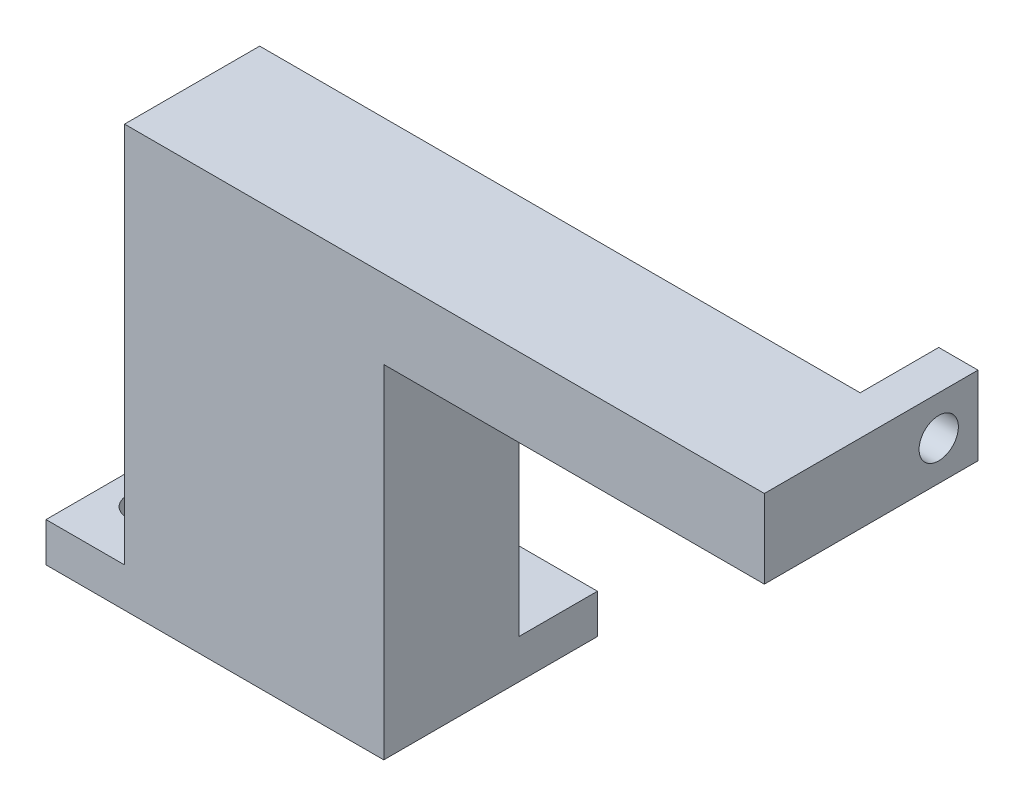
ISO-10303-21;
HEADER;
FILE_DESCRIPTION(('STEP AP214'),'2;1');
FILE_NAME('part.step','',(''),(''),'','','');
FILE_SCHEMA(('AUTOMOTIVE_DESIGN { 1 0 10303 214 1 1 1 1 }'));
ENDSEC;
DATA;
#1=APPLICATION_CONTEXT('core data for automotive mechanical design processes');
#2=APPLICATION_PROTOCOL_DEFINITION('international standard','automotive_design',2000,#1);
#3=PRODUCT_CONTEXT('',#1,'mechanical');
#4=PRODUCT('Part','Part','',(#3));
#5=PRODUCT_RELATED_PRODUCT_CATEGORY('part','',(#4));
#6=PRODUCT_DEFINITION_FORMATION('','',#4);
#7=PRODUCT_DEFINITION_CONTEXT('part definition',#1,'design');
#8=PRODUCT_DEFINITION('design','',#6,#7);
#9=PRODUCT_DEFINITION_SHAPE('','',#8);
#10=(LENGTH_UNIT() NAMED_UNIT(*) SI_UNIT(.MILLI.,.METRE.));
#11=(NAMED_UNIT(*) PLANE_ANGLE_UNIT() SI_UNIT($,.RADIAN.));
#12=(NAMED_UNIT(*) SI_UNIT($,.STERADIAN.) SOLID_ANGLE_UNIT());
#13=UNCERTAINTY_MEASURE_WITH_UNIT(LENGTH_MEASURE(1.E-05),#10,'distance_accuracy_value','');
#14=(GEOMETRIC_REPRESENTATION_CONTEXT(3) GLOBAL_UNCERTAINTY_ASSIGNED_CONTEXT((#13)) GLOBAL_UNIT_ASSIGNED_CONTEXT((#10,
#11,#12)) REPRESENTATION_CONTEXT('',''));
#15=CARTESIAN_POINT('',(0.,0.,0.));
#16=DIRECTION('',(0.,0.,1.));
#17=DIRECTION('',(1.,0.,0.));
#18=AXIS2_PLACEMENT_3D('',#15,#16,#17);
#19=CARTESIAN_POINT('',(-22.77,53.6,-7.8375));
#20=DIRECTION('',(1.,0.,0.));
#21=DIRECTION('',(0.,0.,1.));
#22=AXIS2_PLACEMENT_3D('',#19,#20,#21);
#23=PLANE('',#22);
#24=DIRECTION('',(0.,0.,1.));
#25=VECTOR('',#24,1.);
#26=CARTESIAN_POINT('',(-22.77,5.,-35.0375));
#27=LINE('',#26,#25);
#28=CARTESIAN_POINT('',(-22.77,5.,-25.0375));
#29=VERTEX_POINT('',#28);
#30=CARTESIAN_POINT('',(-22.77,5.,-7.8375));
#31=VERTEX_POINT('',#30);
#32=EDGE_CURVE('E11',#29,#31,#27,.T.);
#33=ORIENTED_EDGE('',*,*,#32,.T.);
#34=DIRECTION('',(0.,-1.,0.));
#35=VECTOR('',#34,1.);
#36=CARTESIAN_POINT('',(-22.77,53.6,-7.8375));
#37=LINE('',#36,#35);
#38=CARTESIAN_POINT('',(-22.77,53.6,-7.8375));
#39=VERTEX_POINT('',#38);
#40=EDGE_CURVE('E194',#39,#31,#37,.T.);
#41=ORIENTED_EDGE('',*,*,#40,.F.);
#42=DIRECTION('',(0.,0.,-1.));
#43=VECTOR('',#42,1.);
#44=CARTESIAN_POINT('',(-22.77,53.6,-7.8375));
#45=LINE('',#44,#43);
#46=CARTESIAN_POINT('',(-22.77,53.6,-25.0375));
#47=VERTEX_POINT('',#46);
#48=EDGE_CURVE('E182',#39,#47,#45,.T.);
#49=ORIENTED_EDGE('',*,*,#48,.T.);
#50=DIRECTION('',(0.,-1.,0.));
#51=VECTOR('',#50,1.);
#52=CARTESIAN_POINT('',(-22.77,53.6,-25.0375));
#53=LINE('',#52,#51);
#54=EDGE_CURVE('E44',#47,#29,#53,.T.);
#55=ORIENTED_EDGE('',*,*,#54,.T.);
#56=EDGE_LOOP('',(#33,#41,#49,#55));
#57=FACE_BOUND('',#56,.T.);
#58=ADVANCED_FACE('F41',(#57),#23,.F.);
#59=CARTESIAN_POINT('',(-22.77,53.6,-25.0375));
#60=DIRECTION('',(0.,0.,1.));
#61=DIRECTION('',(-1.,0.,0.));
#62=AXIS2_PLACEMENT_3D('',#59,#60,#61);
#63=PLANE('',#62);
#64=DIRECTION('',(0.,-1.,0.));
#65=VECTOR('',#64,1.);
#66=CARTESIAN_POINT('',(53.68,53.6,-25.0375));
#67=LINE('',#66,#65);
#68=CARTESIAN_POINT('',(53.68,53.6,-25.0375));
#69=VERTEX_POINT('',#68);
#70=CARTESIAN_POINT('',(53.68,43.6,-25.0375));
#71=VERTEX_POINT('',#70);
#72=EDGE_CURVE('E221',#69,#71,#67,.T.);
#73=ORIENTED_EDGE('',*,*,#72,.T.);
#74=DIRECTION('',(-1.,0.,0.));
#75=VECTOR('',#74,1.);
#76=CARTESIAN_POINT('',(58.68,43.6,-25.0375));
#77=LINE('',#76,#75);
#78=CARTESIAN_POINT('',(10.23,43.6,-25.0375));
#79=VERTEX_POINT('',#78);
#80=EDGE_CURVE('E177',#71,#79,#77,.T.);
#81=ORIENTED_EDGE('',*,*,#80,.T.);
#82=DIRECTION('',(0.,-1.,0.));
#83=VECTOR('',#82,1.);
#84=CARTESIAN_POINT('',(10.23,53.6,-25.0375));
#85=LINE('',#84,#83);
#86=CARTESIAN_POINT('',(10.23,5.,-25.0375));
#87=VERTEX_POINT('',#86);
#88=EDGE_CURVE('E207',#79,#87,#85,.T.);
#89=ORIENTED_EDGE('',*,*,#88,.T.);
#90=DIRECTION('',(-1.,0.,0.));
#91=VECTOR('',#90,1.);
#92=CARTESIAN_POINT('',(-22.77,5.,-25.0375));
#93=LINE('',#92,#91);
#94=EDGE_CURVE('E157',#87,#29,#93,.T.);
#95=ORIENTED_EDGE('',*,*,#94,.T.);
#96=ORIENTED_EDGE('',*,*,#54,.F.);
#97=DIRECTION('',(1.,0.,0.));
#98=VECTOR('',#97,1.);
#99=CARTESIAN_POINT('',(-22.77,53.6,-25.0375));
#100=LINE('',#99,#98);
#101=EDGE_CURVE('E186',#47,#69,#100,.T.);
#102=ORIENTED_EDGE('',*,*,#101,.T.);
#103=EDGE_LOOP('',(#73,#81,#89,#95,#96,#102));
#104=FACE_BOUND('',#103,.T.);
#105=ADVANCED_FACE('F234',(#104),#63,.F.);
#106=CARTESIAN_POINT('',(10.23,53.6,-7.8375));
#107=DIRECTION('',(-1.,0.,0.));
#108=DIRECTION('',(0.,0.,-1.));
#109=AXIS2_PLACEMENT_3D('',#106,#107,#108);
#110=PLANE('',#109);
#111=DIRECTION('',(0.,0.,1.));
#112=VECTOR('',#111,1.);
#113=CARTESIAN_POINT('',(10.23,43.6,-25.0375));
#114=LINE('',#113,#112);
#115=CARTESIAN_POINT('',(10.23,43.6,-7.8375));
#116=VERTEX_POINT('',#115);
#117=EDGE_CURVE('E65',#79,#116,#114,.T.);
#118=ORIENTED_EDGE('',*,*,#117,.T.);
#119=DIRECTION('',(0.,-1.,0.));
#120=VECTOR('',#119,1.);
#121=CARTESIAN_POINT('',(10.23,53.6,-7.8375));
#122=LINE('',#121,#120);
#123=CARTESIAN_POINT('',(10.23,0.,-7.8375));
#124=VERTEX_POINT('',#123);
#125=EDGE_CURVE('E204',#116,#124,#122,.T.);
#126=ORIENTED_EDGE('',*,*,#125,.T.);
#127=DIRECTION('',(0.,0.,1.));
#128=VECTOR('',#127,1.);
#129=CARTESIAN_POINT('',(10.23,0.,-7.8375));
#130=LINE('',#129,#128);
#131=CARTESIAN_POINT('',(10.23,0.,-35.0375));
#132=VERTEX_POINT('',#131);
#133=EDGE_CURVE('E181',#132,#124,#130,.T.);
#134=ORIENTED_EDGE('',*,*,#133,.F.);
#135=DIRECTION('',(0.,1.,0.));
#136=VECTOR('',#135,1.);
#137=CARTESIAN_POINT('',(10.23,0.,-35.0375));
#138=LINE('',#137,#136);
#139=CARTESIAN_POINT('',(10.23,5.,-35.0375));
#140=VERTEX_POINT('',#139);
#141=EDGE_CURVE('E149',#132,#140,#138,.T.);
#142=ORIENTED_EDGE('',*,*,#141,.T.);
#143=DIRECTION('',(0.,0.,1.));
#144=VECTOR('',#143,1.);
#145=CARTESIAN_POINT('',(10.23,5.,-35.0375));
#146=LINE('',#145,#144);
#147=EDGE_CURVE('E57',#140,#87,#146,.T.);
#148=ORIENTED_EDGE('',*,*,#147,.T.);
#149=ORIENTED_EDGE('',*,*,#88,.F.);
#150=EDGE_LOOP('',(#118,#126,#134,#142,#148,#149));
#151=FACE_BOUND('',#150,.T.);
#152=ADVANCED_FACE('F256',(#151),#110,.F.);
#153=CARTESIAN_POINT('',(-22.77,53.6,-7.8375));
#154=DIRECTION('',(0.,0.,-1.));
#155=DIRECTION('',(1.,0.,0.));
#156=AXIS2_PLACEMENT_3D('',#153,#154,#155);
#157=PLANE('',#156);
#158=DIRECTION('',(-1.,0.,0.));
#159=VECTOR('',#158,1.);
#160=CARTESIAN_POINT('',(-22.77,0.,-7.8375));
#161=LINE('',#160,#159);
#162=CARTESIAN_POINT('',(-32.77,0.,-7.8375));
#163=VERTEX_POINT('',#162);
#164=EDGE_CURVE('E187',#124,#163,#161,.T.);
#165=ORIENTED_EDGE('',*,*,#164,.F.);
#166=ORIENTED_EDGE('',*,*,#125,.F.);
#167=DIRECTION('',(-1.,0.,0.));
#168=VECTOR('',#167,1.);
#169=CARTESIAN_POINT('',(58.68,43.6,-7.83749999999998));
#170=LINE('',#169,#168);
#171=CARTESIAN_POINT('',(58.68,43.6,-7.83749999999998));
#172=VERTEX_POINT('',#171);
#173=EDGE_CURVE('E172',#172,#116,#170,.T.);
#174=ORIENTED_EDGE('',*,*,#173,.F.);
#175=DIRECTION('',(0.,1.,0.));
#176=VECTOR('',#175,1.);
#177=CARTESIAN_POINT('',(58.68,53.6,-7.83749999999998));
#178=LINE('',#177,#176);
#179=CARTESIAN_POINT('',(58.68,53.6,-7.83749999999998));
#180=VERTEX_POINT('',#179);
#181=EDGE_CURVE('E164',#172,#180,#178,.T.);
#182=ORIENTED_EDGE('',*,*,#181,.T.);
#183=DIRECTION('',(-1.,0.,0.));
#184=VECTOR('',#183,1.);
#185=CARTESIAN_POINT('',(-22.77,53.6,-7.8375));
#186=LINE('',#185,#184);
#187=EDGE_CURVE('E191',#180,#39,#186,.T.);
#188=ORIENTED_EDGE('',*,*,#187,.T.);
#189=ORIENTED_EDGE('',*,*,#40,.T.);
#190=DIRECTION('',(1.,0.,0.));
#191=VECTOR('',#190,1.);
#192=CARTESIAN_POINT('',(-32.77,5.,-7.8375));
#193=LINE('',#192,#191);
#194=CARTESIAN_POINT('',(-32.77,5.,-7.8375));
#195=VERTEX_POINT('',#194);
#196=EDGE_CURVE('E218',#195,#31,#193,.T.);
#197=ORIENTED_EDGE('',*,*,#196,.F.);
#198=DIRECTION('',(0.,-1.,0.));
#199=VECTOR('',#198,1.);
#200=CARTESIAN_POINT('',(-32.77,5.,-7.8375));
#201=LINE('',#200,#199);
#202=EDGE_CURVE('E142',#195,#163,#201,.T.);
#203=ORIENTED_EDGE('',*,*,#202,.T.);
#204=EDGE_LOOP('',(#165,#166,#174,#182,#188,#189,#197,#203));
#205=FACE_BOUND('',#204,.T.);
#206=ADVANCED_FACE('F224',(#205),#157,.F.);
#207=CARTESIAN_POINT('',(0.,53.6,-15.675));
#208=DIRECTION('',(0.,1.,0.));
#209=DIRECTION('',(0.,0.,-1.));
#210=AXIS2_PLACEMENT_3D('',#207,#208,#209);
#211=PLANE('',#210);
#212=ORIENTED_EDGE('',*,*,#48,.F.);
#213=ORIENTED_EDGE('',*,*,#187,.F.);
#214=DIRECTION('',(0.,0.,-1.));
#215=VECTOR('',#214,1.);
#216=CARTESIAN_POINT('',(58.68,53.6,-25.0375));
#217=LINE('',#216,#215);
#218=CARTESIAN_POINT('',(58.68,53.6,-35.0375));
#219=VERTEX_POINT('',#218);
#220=EDGE_CURVE('E168',#180,#219,#217,.T.);
#221=ORIENTED_EDGE('',*,*,#220,.T.);
#222=DIRECTION('',(-1.,0.,0.));
#223=VECTOR('',#222,1.);
#224=CARTESIAN_POINT('',(58.68,53.6,-35.0375));
#225=LINE('',#224,#223);
#226=CARTESIAN_POINT('',(53.68,53.6,-35.0375));
#227=VERTEX_POINT('',#226);
#228=EDGE_CURVE('E243',#219,#227,#225,.T.);
#229=ORIENTED_EDGE('',*,*,#228,.T.);
#230=DIRECTION('',(0.,0.,1.));
#231=VECTOR('',#230,1.);
#232=CARTESIAN_POINT('',(53.68,53.6,-35.0375));
#233=LINE('',#232,#231);
#234=EDGE_CURVE('E159',#227,#69,#233,.T.);
#235=ORIENTED_EDGE('',*,*,#234,.T.);
#236=ORIENTED_EDGE('',*,*,#101,.F.);
#237=EDGE_LOOP('',(#212,#213,#221,#229,#235,#236));
#238=FACE_BOUND('',#237,.T.);
#239=ADVANCED_FACE('F229',(#238),#211,.T.);
#240=CARTESIAN_POINT('',(0.,0.,-15.675));
#241=DIRECTION('',(0.,1.,0.));
#242=DIRECTION('',(0.,0.,-1.));
#243=AXIS2_PLACEMENT_3D('',#240,#241,#242);
#244=PLANE('',#243);
#245=CARTESIAN_POINT('',(-27.77,0.,-15.675));
#246=DIRECTION('',(0.,-1.,0.));
#247=DIRECTION('',(0.,0.,-1.));
#248=AXIS2_PLACEMENT_3D('',#245,#246,#247);
#249=CIRCLE('',#248,2.5);
#250=CARTESIAN_POINT('',(-27.77,0.,-18.175));
#251=VERTEX_POINT('',#250);
#252=EDGE_CURVE('E401',#251,#251,#249,.T.);
#253=ORIENTED_EDGE('',*,*,#252,.F.);
#254=EDGE_LOOP('',(#253));
#255=FACE_BOUND('',#254,.T.);
#256=CARTESIAN_POINT('',(-6.27000000000003,0.,-30.0375));
#257=DIRECTION('',(0.,-1.,0.));
#258=DIRECTION('',(0.,0.,-1.));
#259=AXIS2_PLACEMENT_3D('',#256,#257,#258);
#260=CIRCLE('',#259,2.5);
#261=CARTESIAN_POINT('',(-6.27000000000003,0.,-32.5375));
#262=VERTEX_POINT('',#261);
#263=EDGE_CURVE('E404',#262,#262,#260,.T.);
#264=ORIENTED_EDGE('',*,*,#263,.F.);
#265=EDGE_LOOP('',(#264));
#266=FACE_BOUND('',#265,.T.);
#267=DIRECTION('',(1.,0.,0.));
#268=VECTOR('',#267,1.);
#269=CARTESIAN_POINT('',(-22.77,0.,-35.0375));
#270=LINE('',#269,#268);
#271=CARTESIAN_POINT('',(-32.77,0.,-35.0375));
#272=VERTEX_POINT('',#271);
#273=EDGE_CURVE('E132',#272,#132,#270,.T.);
#274=ORIENTED_EDGE('',*,*,#273,.T.);
#275=ORIENTED_EDGE('',*,*,#133,.T.);
#276=ORIENTED_EDGE('',*,*,#164,.T.);
#277=DIRECTION('',(0.,0.,-1.));
#278=VECTOR('',#277,1.);
#279=CARTESIAN_POINT('',(-32.77,0.,-35.0375));
#280=LINE('',#279,#278);
#281=EDGE_CURVE('E222',#163,#272,#280,.T.);
#282=ORIENTED_EDGE('',*,*,#281,.T.);
#283=EDGE_LOOP('',(#274,#275,#276,#282));
#284=FACE_BOUND('',#283,.T.);
#285=ADVANCED_FACE('F254',(#255,#266,#284),#244,.F.);
#286=CARTESIAN_POINT('',(58.68,43.6,-25.0375));
#287=DIRECTION('',(0.,1.,0.));
#288=DIRECTION('',(0.,0.,-1.));
#289=AXIS2_PLACEMENT_3D('',#286,#287,#288);
#290=PLANE('',#289);
#291=ORIENTED_EDGE('',*,*,#117,.F.);
#292=ORIENTED_EDGE('',*,*,#80,.F.);
#293=DIRECTION('',(0.,0.,1.));
#294=VECTOR('',#293,1.);
#295=CARTESIAN_POINT('',(53.68,43.6,-35.0375));
#296=LINE('',#295,#294);
#297=CARTESIAN_POINT('',(53.68,43.6,-35.0375));
#298=VERTEX_POINT('',#297);
#299=EDGE_CURVE('E238',#298,#71,#296,.T.);
#300=ORIENTED_EDGE('',*,*,#299,.F.);
#301=DIRECTION('',(1.,0.,0.));
#302=VECTOR('',#301,1.);
#303=CARTESIAN_POINT('',(58.68,43.6,-35.0375));
#304=LINE('',#303,#302);
#305=CARTESIAN_POINT('',(58.68,43.6,-35.0375));
#306=VERTEX_POINT('',#305);
#307=EDGE_CURVE('E247',#298,#306,#304,.T.);
#308=ORIENTED_EDGE('',*,*,#307,.T.);
#309=DIRECTION('',(0.,0.,1.));
#310=VECTOR('',#309,1.);
#311=CARTESIAN_POINT('',(58.68,43.6,-25.0375));
#312=LINE('',#311,#310);
#313=EDGE_CURVE('E161',#306,#172,#312,.T.);
#314=ORIENTED_EDGE('',*,*,#313,.T.);
#315=ORIENTED_EDGE('',*,*,#173,.T.);
#316=EDGE_LOOP('',(#291,#292,#300,#308,#314,#315));
#317=FACE_BOUND('',#316,.T.);
#318=ADVANCED_FACE('F269',(#317),#290,.F.);
#319=CARTESIAN_POINT('',(58.68,0.,-15.675));
#320=DIRECTION('',(1.,0.,0.));
#321=DIRECTION('',(0.,0.,1.));
#322=AXIS2_PLACEMENT_3D('',#319,#320,#321);
#323=PLANE('',#322);
#324=CARTESIAN_POINT('',(58.68,48.6,-30.0375));
#325=DIRECTION('',(-1.,0.,0.));
#326=DIRECTION('',(0.,0.,1.));
#327=AXIS2_PLACEMENT_3D('',#324,#325,#326);
#328=CIRCLE('',#327,2.5);
#329=CARTESIAN_POINT('',(58.68,48.6,-27.5375));
#330=VERTEX_POINT('',#329);
#331=EDGE_CURVE('E137',#330,#330,#328,.T.);
#332=ORIENTED_EDGE('',*,*,#331,.T.);
#333=EDGE_LOOP('',(#332));
#334=FACE_BOUND('',#333,.T.);
#335=ORIENTED_EDGE('',*,*,#220,.F.);
#336=ORIENTED_EDGE('',*,*,#181,.F.);
#337=ORIENTED_EDGE('',*,*,#313,.F.);
#338=DIRECTION('',(0.,1.,0.));
#339=VECTOR('',#338,1.);
#340=CARTESIAN_POINT('',(58.68,53.6,-35.0375));
#341=LINE('',#340,#339);
#342=EDGE_CURVE('E240',#306,#219,#341,.T.);
#343=ORIENTED_EDGE('',*,*,#342,.T.);
#344=EDGE_LOOP('',(#335,#336,#337,#343));
#345=FACE_BOUND('',#344,.T.);
#346=ADVANCED_FACE('F275',(#334,#345),#323,.T.);
#347=CARTESIAN_POINT('',(-22.77,5.,-35.0375));
#348=DIRECTION('',(0.,-1.,0.));
#349=DIRECTION('',(1.,0.,0.));
#350=AXIS2_PLACEMENT_3D('',#347,#348,#349);
#351=PLANE('',#350);
#352=CARTESIAN_POINT('',(-27.77,5.,-15.675));
#353=DIRECTION('',(0.,-1.,0.));
#354=DIRECTION('',(-1.,0.,0.));
#355=AXIS2_PLACEMENT_3D('',#352,#353,#354);
#356=CIRCLE('',#355,2.5);
#357=CARTESIAN_POINT('',(-30.27,5.,-15.675));
#358=VERTEX_POINT('',#357);
#359=EDGE_CURVE('E398',#358,#358,#356,.T.);
#360=ORIENTED_EDGE('',*,*,#359,.T.);
#361=EDGE_LOOP('',(#360));
#362=FACE_BOUND('',#361,.T.);
#363=CARTESIAN_POINT('',(-6.27000000000003,5.,-30.0375));
#364=DIRECTION('',(0.,-1.,0.));
#365=DIRECTION('',(-1.,0.,0.));
#366=AXIS2_PLACEMENT_3D('',#363,#364,#365);
#367=CIRCLE('',#366,2.5);
#368=CARTESIAN_POINT('',(-8.77000000000003,5.,-30.0375));
#369=VERTEX_POINT('',#368);
#370=EDGE_CURVE('E418',#369,#369,#367,.T.);
#371=ORIENTED_EDGE('',*,*,#370,.T.);
#372=EDGE_LOOP('',(#371));
#373=FACE_BOUND('',#372,.T.);
#374=ORIENTED_EDGE('',*,*,#94,.F.);
#375=ORIENTED_EDGE('',*,*,#147,.F.);
#376=DIRECTION('',(-1.,0.,0.));
#377=VECTOR('',#376,1.);
#378=CARTESIAN_POINT('',(-22.77,5.,-35.0375));
#379=LINE('',#378,#377);
#380=CARTESIAN_POINT('',(-32.77,5.,-35.0375));
#381=VERTEX_POINT('',#380);
#382=EDGE_CURVE('E131',#140,#381,#379,.T.);
#383=ORIENTED_EDGE('',*,*,#382,.T.);
#384=DIRECTION('',(0.,0.,1.));
#385=VECTOR('',#384,1.);
#386=CARTESIAN_POINT('',(-32.77,5.,-35.0375));
#387=LINE('',#386,#385);
#388=EDGE_CURVE('E136',#381,#195,#387,.T.);
#389=ORIENTED_EDGE('',*,*,#388,.T.);
#390=ORIENTED_EDGE('',*,*,#196,.T.);
#391=ORIENTED_EDGE('',*,*,#32,.F.);
#392=EDGE_LOOP('',(#374,#375,#383,#389,#390,#391));
#393=FACE_BOUND('',#392,.T.);
#394=ADVANCED_FACE('F147',(#362,#373,#393),#351,.F.);
#395=CARTESIAN_POINT('',(0.,0.,-35.0375));
#396=DIRECTION('',(0.,0.,1.));
#397=DIRECTION('',(-1.,0.,0.));
#398=AXIS2_PLACEMENT_3D('',#395,#396,#397);
#399=PLANE('',#398);
#400=ORIENTED_EDGE('',*,*,#382,.F.);
#401=ORIENTED_EDGE('',*,*,#141,.F.);
#402=ORIENTED_EDGE('',*,*,#273,.F.);
#403=DIRECTION('',(0.,1.,0.));
#404=VECTOR('',#403,1.);
#405=CARTESIAN_POINT('',(-32.77,5.,-35.0375));
#406=LINE('',#405,#404);
#407=EDGE_CURVE('E126',#272,#381,#406,.T.);
#408=ORIENTED_EDGE('',*,*,#407,.T.);
#409=EDGE_LOOP('',(#400,#401,#402,#408));
#410=FACE_BOUND('',#409,.T.);
#411=ADVANCED_FACE('F128',(#410),#399,.F.);
#412=CARTESIAN_POINT('',(53.68,53.6,-35.0375));
#413=DIRECTION('',(1.,0.,0.));
#414=DIRECTION('',(0.,0.,1.));
#415=AXIS2_PLACEMENT_3D('',#412,#413,#414);
#416=PLANE('',#415);
#417=CARTESIAN_POINT('',(53.68,48.6,-30.0375));
#418=DIRECTION('',(1.,0.,0.));
#419=DIRECTION('',(0.,0.,-1.));
#420=AXIS2_PLACEMENT_3D('',#417,#418,#419);
#421=CIRCLE('',#420,2.5);
#422=CARTESIAN_POINT('',(53.68,48.6,-32.5375));
#423=VERTEX_POINT('',#422);
#424=EDGE_CURVE('E403',#423,#423,#421,.T.);
#425=ORIENTED_EDGE('',*,*,#424,.T.);
#426=EDGE_LOOP('',(#425));
#427=FACE_BOUND('',#426,.T.);
#428=ORIENTED_EDGE('',*,*,#72,.F.);
#429=ORIENTED_EDGE('',*,*,#234,.F.);
#430=DIRECTION('',(0.,-1.,0.));
#431=VECTOR('',#430,1.);
#432=CARTESIAN_POINT('',(53.68,53.6,-35.0375));
#433=LINE('',#432,#431);
#434=EDGE_CURVE('E264',#227,#298,#433,.T.);
#435=ORIENTED_EDGE('',*,*,#434,.T.);
#436=ORIENTED_EDGE('',*,*,#299,.T.);
#437=EDGE_LOOP('',(#428,#429,#435,#436));
#438=FACE_BOUND('',#437,.T.);
#439=ADVANCED_FACE('F236',(#427,#438),#416,.F.);
#440=CARTESIAN_POINT('',(0.,0.,-35.0375));
#441=DIRECTION('',(0.,0.,1.));
#442=DIRECTION('',(-1.,0.,0.));
#443=AXIS2_PLACEMENT_3D('',#440,#441,#442);
#444=PLANE('',#443);
#445=ORIENTED_EDGE('',*,*,#342,.F.);
#446=ORIENTED_EDGE('',*,*,#307,.F.);
#447=ORIENTED_EDGE('',*,*,#434,.F.);
#448=ORIENTED_EDGE('',*,*,#228,.F.);
#449=EDGE_LOOP('',(#445,#446,#447,#448));
#450=FACE_BOUND('',#449,.T.);
#451=ADVANCED_FACE('F272',(#450),#444,.F.);
#452=CARTESIAN_POINT('',(-32.77,0.,-15.675));
#453=DIRECTION('',(1.,0.,0.));
#454=DIRECTION('',(0.,0.,1.));
#455=AXIS2_PLACEMENT_3D('',#452,#453,#454);
#456=PLANE('',#455);
#457=ORIENTED_EDGE('',*,*,#407,.F.);
#458=ORIENTED_EDGE('',*,*,#281,.F.);
#459=ORIENTED_EDGE('',*,*,#202,.F.);
#460=ORIENTED_EDGE('',*,*,#388,.F.);
#461=EDGE_LOOP('',(#457,#458,#459,#460));
#462=FACE_BOUND('',#461,.T.);
#463=ADVANCED_FACE('F140',(#462),#456,.F.);
#464=CARTESIAN_POINT('',(63.68,48.6,-30.0375));
#465=DIRECTION('',(-1.,0.,0.));
#466=DIRECTION('',(0.,0.,-1.));
#467=AXIS2_PLACEMENT_3D('',#464,#465,#466);
#468=CYLINDRICAL_SURFACE('',#467,2.5);
#469=ORIENTED_EDGE('',*,*,#331,.F.);
#470=EDGE_LOOP('',(#469));
#471=FACE_BOUND('',#470,.T.);
#472=ORIENTED_EDGE('',*,*,#424,.F.);
#473=EDGE_LOOP('',(#472));
#474=FACE_BOUND('',#473,.T.);
#475=ADVANCED_FACE('F362',(#471,#474),#468,.F.);
#476=CARTESIAN_POINT('',(-6.27000000000003,-5.,-30.0375));
#477=DIRECTION('',(0.,1.,0.));
#478=DIRECTION('',(-1.,0.,0.));
#479=AXIS2_PLACEMENT_3D('',#476,#477,#478);
#480=CYLINDRICAL_SURFACE('',#479,2.5);
#481=ORIENTED_EDGE('',*,*,#370,.F.);
#482=EDGE_LOOP('',(#481));
#483=FACE_BOUND('',#482,.T.);
#484=ORIENTED_EDGE('',*,*,#263,.T.);
#485=EDGE_LOOP('',(#484));
#486=FACE_BOUND('',#485,.T.);
#487=ADVANCED_FACE('F371',(#483,#486),#480,.F.);
#488=CARTESIAN_POINT('',(-27.77,-5.,-15.675));
#489=DIRECTION('',(0.,1.,0.));
#490=DIRECTION('',(-1.,0.,0.));
#491=AXIS2_PLACEMENT_3D('',#488,#489,#490);
#492=CYLINDRICAL_SURFACE('',#491,2.5);
#493=ORIENTED_EDGE('',*,*,#359,.F.);
#494=EDGE_LOOP('',(#493));
#495=FACE_BOUND('',#494,.T.);
#496=ORIENTED_EDGE('',*,*,#252,.T.);
#497=EDGE_LOOP('',(#496));
#498=FACE_BOUND('',#497,.T.);
#499=ADVANCED_FACE('F381',(#495,#498),#492,.F.);
#500=CLOSED_SHELL('',(#58,#105,#152,#206,#239,#285,#318,#346,#394,#411,#439,#451,#463,#475,#487,#499));
#501=MANIFOLD_SOLID_BREP('B2',#500);
#502=ADVANCED_BREP_SHAPE_REPRESENTATION('',(#18,#501),#14);
#503=SHAPE_DEFINITION_REPRESENTATION(#9,#502);
ENDSEC;
END-ISO-10303-21;
